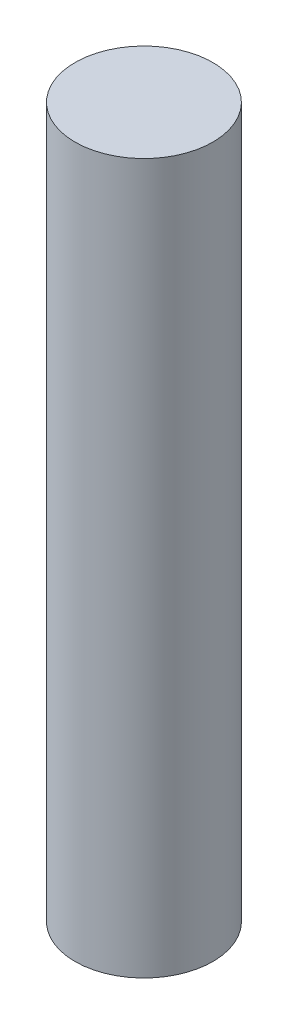
ISO-10303-21;
HEADER;
FILE_DESCRIPTION(('STEP AP214'),'2;1');
FILE_NAME('part.step','',(''),(''),'','','');
FILE_SCHEMA(('AUTOMOTIVE_DESIGN { 1 0 10303 214 1 1 1 1 }'));
ENDSEC;
DATA;
#1=APPLICATION_CONTEXT('core data for automotive mechanical design processes');
#2=APPLICATION_PROTOCOL_DEFINITION('international standard','automotive_design',2000,#1);
#3=PRODUCT_CONTEXT('',#1,'mechanical');
#4=PRODUCT('Part','Part','',(#3));
#5=PRODUCT_RELATED_PRODUCT_CATEGORY('part','',(#4));
#6=PRODUCT_DEFINITION_FORMATION('','',#4);
#7=PRODUCT_DEFINITION_CONTEXT('part definition',#1,'design');
#8=PRODUCT_DEFINITION('design','',#6,#7);
#9=PRODUCT_DEFINITION_SHAPE('','',#8);
#10=(LENGTH_UNIT() NAMED_UNIT(*) SI_UNIT(.MILLI.,.METRE.));
#11=(NAMED_UNIT(*) PLANE_ANGLE_UNIT() SI_UNIT($,.RADIAN.));
#12=(NAMED_UNIT(*) SI_UNIT($,.STERADIAN.) SOLID_ANGLE_UNIT());
#13=UNCERTAINTY_MEASURE_WITH_UNIT(LENGTH_MEASURE(1.E-05),#10,'distance_accuracy_value','');
#14=(GEOMETRIC_REPRESENTATION_CONTEXT(3) GLOBAL_UNCERTAINTY_ASSIGNED_CONTEXT((#13)) GLOBAL_UNIT_ASSIGNED_CONTEXT((#10,
#11,#12)) REPRESENTATION_CONTEXT('',''));
#15=CARTESIAN_POINT('',(0.,0.,0.));
#16=DIRECTION('',(0.,0.,1.));
#17=DIRECTION('',(1.,0.,0.));
#18=AXIS2_PLACEMENT_3D('',#15,#16,#17);
#19=CARTESIAN_POINT('',(0.,44.45,0.));
#20=DIRECTION('',(0.,-1.,0.));
#21=DIRECTION('',(0.,0.,-1.));
#22=AXIS2_PLACEMENT_3D('',#19,#20,#21);
#23=CYLINDRICAL_SURFACE('',#22,4.318);
#24=CARTESIAN_POINT('',(0.,44.45,0.));
#25=DIRECTION('',(0.,1.,0.));
#26=DIRECTION('',(0.,0.,1.));
#27=AXIS2_PLACEMENT_3D('',#24,#25,#26);
#28=CIRCLE('',#27,4.318);
#29=CARTESIAN_POINT('',(0.,44.45,4.318));
#30=VERTEX_POINT('',#29);
#31=EDGE_CURVE('E10',#30,#30,#28,.T.);
#32=ORIENTED_EDGE('',*,*,#31,.F.);
#33=EDGE_LOOP('',(#32));
#34=FACE_BOUND('',#33,.T.);
#35=CARTESIAN_POINT('',(0.,0.,0.));
#36=DIRECTION('',(0.,1.,0.));
#37=DIRECTION('',(0.,0.,1.));
#38=AXIS2_PLACEMENT_3D('',#35,#36,#37);
#39=CIRCLE('',#38,4.318);
#40=CARTESIAN_POINT('',(0.,0.,4.318));
#41=VERTEX_POINT('',#40);
#42=EDGE_CURVE('E40',#41,#41,#39,.T.);
#43=ORIENTED_EDGE('',*,*,#42,.T.);
#44=EDGE_LOOP('',(#43));
#45=FACE_BOUND('',#44,.T.);
#46=ADVANCED_FACE('F37',(#34,#45),#23,.T.);
#47=CARTESIAN_POINT('',(0.,44.45,0.));
#48=DIRECTION('',(0.,1.,0.));
#49=DIRECTION('',(0.,0.,1.));
#50=AXIS2_PLACEMENT_3D('',#47,#48,#49);
#51=PLANE('',#50);
#52=ORIENTED_EDGE('',*,*,#31,.T.);
#53=EDGE_LOOP('',(#52));
#54=FACE_BOUND('',#53,.T.);
#55=ADVANCED_FACE('F54',(#54),#51,.T.);
#56=CARTESIAN_POINT('',(0.,0.,0.));
#57=DIRECTION('',(0.,1.,0.));
#58=DIRECTION('',(0.,0.,1.));
#59=AXIS2_PLACEMENT_3D('',#56,#57,#58);
#60=PLANE('',#59);
#61=ORIENTED_EDGE('',*,*,#42,.F.);
#62=EDGE_LOOP('',(#61));
#63=FACE_BOUND('',#62,.T.);
#64=ADVANCED_FACE('F52',(#63),#60,.F.);
#65=CLOSED_SHELL('',(#46,#55,#64));
#66=MANIFOLD_SOLID_BREP('B2',#65);
#67=ADVANCED_BREP_SHAPE_REPRESENTATION('',(#18,#66),#14);
#68=SHAPE_DEFINITION_REPRESENTATION(#9,#67);
ENDSEC;
END-ISO-10303-21;
